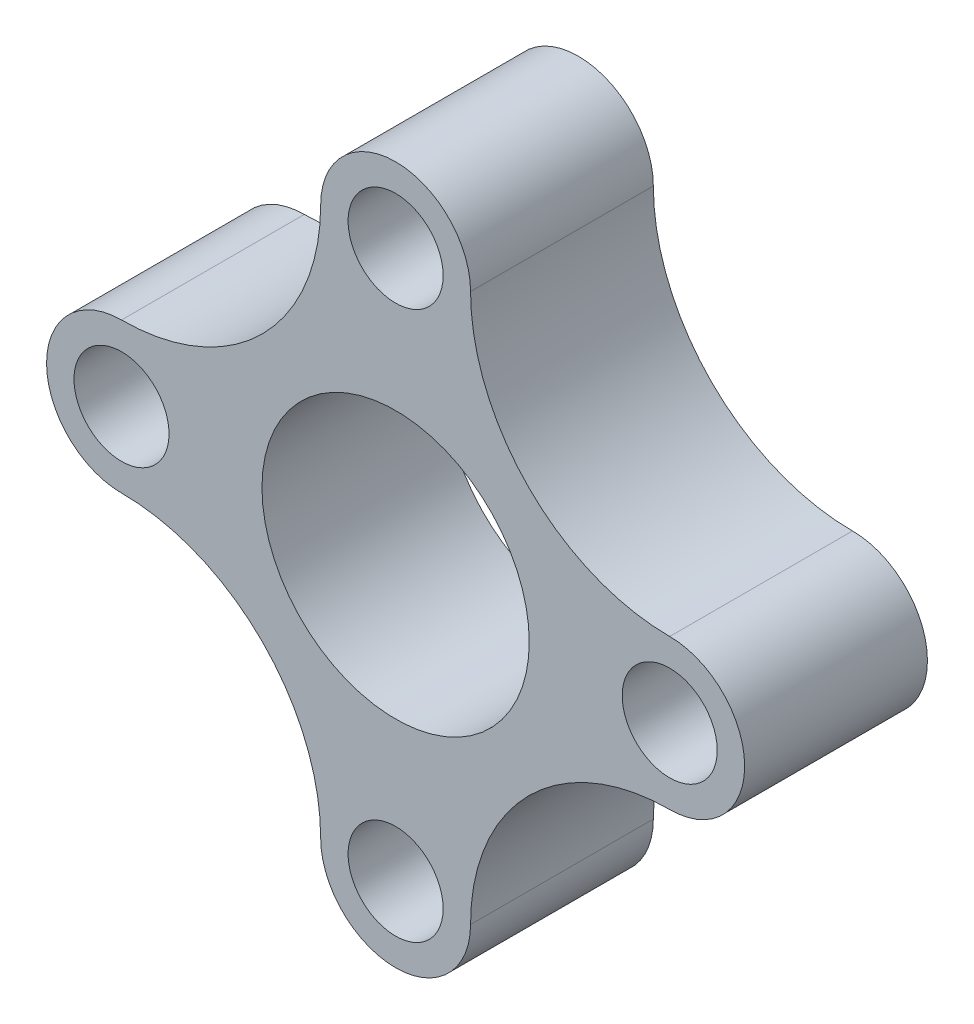
ISO-10303-21;
HEADER;
FILE_DESCRIPTION(('STEP AP214'),'2;1');
FILE_NAME('part.step','',(''),(''),'','','');
FILE_SCHEMA(('AUTOMOTIVE_DESIGN { 1 0 10303 214 1 1 1 1 }'));
ENDSEC;
DATA;
#1=APPLICATION_CONTEXT('core data for automotive mechanical design processes');
#2=APPLICATION_PROTOCOL_DEFINITION('international standard','automotive_design',2000,#1);
#3=PRODUCT_CONTEXT('',#1,'mechanical');
#4=PRODUCT('Part','Part','',(#3));
#5=PRODUCT_RELATED_PRODUCT_CATEGORY('part','',(#4));
#6=PRODUCT_DEFINITION_FORMATION('','',#4);
#7=PRODUCT_DEFINITION_CONTEXT('part definition',#1,'design');
#8=PRODUCT_DEFINITION('design','',#6,#7);
#9=PRODUCT_DEFINITION_SHAPE('','',#8);
#10=(LENGTH_UNIT() NAMED_UNIT(*) SI_UNIT(.MILLI.,.METRE.));
#11=(NAMED_UNIT(*) PLANE_ANGLE_UNIT() SI_UNIT($,.RADIAN.));
#12=(NAMED_UNIT(*) SI_UNIT($,.STERADIAN.) SOLID_ANGLE_UNIT());
#13=UNCERTAINTY_MEASURE_WITH_UNIT(LENGTH_MEASURE(1.E-05),#10,'distance_accuracy_value','');
#14=(GEOMETRIC_REPRESENTATION_CONTEXT(3) GLOBAL_UNCERTAINTY_ASSIGNED_CONTEXT((#13)) GLOBAL_UNIT_ASSIGNED_CONTEXT((#10,
#11,#12)) REPRESENTATION_CONTEXT('',''));
#15=CARTESIAN_POINT('',(0.,0.,0.));
#16=DIRECTION('',(0.,0.,1.));
#17=DIRECTION('',(1.,0.,0.));
#18=AXIS2_PLACEMENT_3D('',#15,#16,#17);
#19=CARTESIAN_POINT('',(14.9957751629703,0.,10.));
#20=DIRECTION('',(0.,0.,1.));
#21=DIRECTION('',(1.,0.,0.));
#22=AXIS2_PLACEMENT_3D('',#19,#20,#21);
#23=PLANE('',#22);
#24=CARTESIAN_POINT('',(-14.9957751629704,0.,10.));
#25=DIRECTION('',(0.,0.,1.));
#26=DIRECTION('',(1.,0.,0.));
#27=AXIS2_PLACEMENT_3D('',#24,#25,#26);
#28=CIRCLE('',#27,2.6);
#29=CARTESIAN_POINT('',(-12.3957751629704,0.,10.));
#30=VERTEX_POINT('',#29);
#31=EDGE_CURVE('E356',#30,#30,#28,.T.);
#32=ORIENTED_EDGE('',*,*,#31,.F.);
#33=EDGE_LOOP('',(#32));
#34=FACE_BOUND('',#33,.T.);
#35=CARTESIAN_POINT('',(14.9957751629703,0.,10.));
#36=DIRECTION('',(0.,0.,1.));
#37=DIRECTION('',(1.,0.,0.));
#38=AXIS2_PLACEMENT_3D('',#35,#36,#37);
#39=CIRCLE('',#38,2.6);
#40=CARTESIAN_POINT('',(17.5957751629703,0.,10.));
#41=VERTEX_POINT('',#40);
#42=EDGE_CURVE('E344',#41,#41,#39,.T.);
#43=ORIENTED_EDGE('',*,*,#42,.F.);
#44=EDGE_LOOP('',(#43));
#45=FACE_BOUND('',#44,.T.);
#46=CARTESIAN_POINT('',(0.,14.9957751629703,10.));
#47=DIRECTION('',(0.,0.,1.));
#48=DIRECTION('',(-1.,0.,0.));
#49=AXIS2_PLACEMENT_3D('',#46,#47,#48);
#50=CIRCLE('',#49,4.1);
#51=CARTESIAN_POINT('',(4.1,14.9957751629703,10.));
#52=VERTEX_POINT('',#51);
#53=CARTESIAN_POINT('',(-4.1,14.9957751629703,10.));
#54=VERTEX_POINT('',#53);
#55=EDGE_CURVE('E120',#52,#54,#50,.T.);
#56=ORIENTED_EDGE('',*,*,#55,.T.);
#57=CARTESIAN_POINT('',(-14.9957751629703,14.9957751629703,10.));
#58=DIRECTION('',(0.,0.,1.));
#59=DIRECTION('',(-1.,0.,0.));
#60=AXIS2_PLACEMENT_3D('',#57,#58,#59);
#61=CIRCLE('',#60,10.8957751629703);
#62=CARTESIAN_POINT('',(-14.9957751629703,4.1,10.));
#63=VERTEX_POINT('',#62);
#64=EDGE_CURVE('E148',#63,#54,#61,.T.);
#65=ORIENTED_EDGE('',*,*,#64,.F.);
#66=CARTESIAN_POINT('',(-14.9957751629703,0.,10.));
#67=DIRECTION('',(0.,0.,-1.));
#68=DIRECTION('',(-1.,0.,0.));
#69=AXIS2_PLACEMENT_3D('',#66,#67,#68);
#70=CIRCLE('',#69,4.1);
#71=CARTESIAN_POINT('',(-14.9957751629703,-4.1,10.));
#72=VERTEX_POINT('',#71);
#73=EDGE_CURVE('E145',#72,#63,#70,.T.);
#74=ORIENTED_EDGE('',*,*,#73,.F.);
#75=CARTESIAN_POINT('',(-14.9957751629703,-14.9957751629703,10.));
#76=DIRECTION('',(0.,0.,-1.));
#77=DIRECTION('',(-1.,0.,0.));
#78=AXIS2_PLACEMENT_3D('',#75,#76,#77);
#79=CIRCLE('',#78,10.8957751629703);
#80=CARTESIAN_POINT('',(-4.1,-14.9957751629703,10.));
#81=VERTEX_POINT('',#80);
#82=EDGE_CURVE('E161',#72,#81,#79,.T.);
#83=ORIENTED_EDGE('',*,*,#82,.T.);
#84=CARTESIAN_POINT('',(0.,-14.9957751629703,10.));
#85=DIRECTION('',(0.,0.,-1.));
#86=DIRECTION('',(-1.,0.,0.));
#87=AXIS2_PLACEMENT_3D('',#84,#85,#86);
#88=CIRCLE('',#87,4.1);
#89=CARTESIAN_POINT('',(4.1,-14.9957751629703,10.));
#90=VERTEX_POINT('',#89);
#91=EDGE_CURVE('E70',#90,#81,#88,.T.);
#92=ORIENTED_EDGE('',*,*,#91,.F.);
#93=CARTESIAN_POINT('',(14.9957751629703,-14.9957751629703,10.));
#94=DIRECTION('',(0.,0.,1.));
#95=DIRECTION('',(1.,0.,0.));
#96=AXIS2_PLACEMENT_3D('',#93,#94,#95);
#97=CIRCLE('',#96,10.8957751629703);
#98=CARTESIAN_POINT('',(14.9957751629703,-4.1,10.));
#99=VERTEX_POINT('',#98);
#100=EDGE_CURVE('E95',#99,#90,#97,.T.);
#101=ORIENTED_EDGE('',*,*,#100,.F.);
#102=CARTESIAN_POINT('',(14.9957751629703,0.,10.));
#103=DIRECTION('',(0.,0.,1.));
#104=DIRECTION('',(1.,0.,0.));
#105=AXIS2_PLACEMENT_3D('',#102,#103,#104);
#106=CIRCLE('',#105,4.1);
#107=CARTESIAN_POINT('',(14.9957751629703,4.1,10.));
#108=VERTEX_POINT('',#107);
#109=EDGE_CURVE('E116',#99,#108,#106,.T.);
#110=ORIENTED_EDGE('',*,*,#109,.T.);
#111=CARTESIAN_POINT('',(14.9957751629703,14.9957751629703,10.));
#112=DIRECTION('',(0.,0.,-1.));
#113=DIRECTION('',(1.,0.,0.));
#114=AXIS2_PLACEMENT_3D('',#111,#112,#113);
#115=CIRCLE('',#114,10.8957751629703);
#116=EDGE_CURVE('E51',#108,#52,#115,.T.);
#117=ORIENTED_EDGE('',*,*,#116,.T.);
#118=EDGE_LOOP('',(#56,#65,#74,#83,#92,#101,#110,#117));
#119=FACE_BOUND('',#118,.T.);
#120=CARTESIAN_POINT('',(0.,14.9957751629703,10.));
#121=DIRECTION('',(0.,0.,1.));
#122=DIRECTION('',(1.,0.,0.));
#123=AXIS2_PLACEMENT_3D('',#120,#121,#122);
#124=CIRCLE('',#123,2.6);
#125=CARTESIAN_POINT('',(2.6,14.9957751629703,10.));
#126=VERTEX_POINT('',#125);
#127=EDGE_CURVE('E169',#126,#126,#124,.T.);
#128=ORIENTED_EDGE('',*,*,#127,.F.);
#129=EDGE_LOOP('',(#128));
#130=FACE_BOUND('',#129,.T.);
#131=CARTESIAN_POINT('',(0.,-14.9957751629704,10.));
#132=DIRECTION('',(0.,0.,1.));
#133=DIRECTION('',(1.,0.,0.));
#134=AXIS2_PLACEMENT_3D('',#131,#132,#133);
#135=CIRCLE('',#134,2.6);
#136=CARTESIAN_POINT('',(2.6,-14.9957751629704,10.));
#137=VERTEX_POINT('',#136);
#138=EDGE_CURVE('E350',#137,#137,#135,.T.);
#139=ORIENTED_EDGE('',*,*,#138,.F.);
#140=EDGE_LOOP('',(#139));
#141=FACE_BOUND('',#140,.T.);
#142=CARTESIAN_POINT('',(0.,0.,10.));
#143=DIRECTION('',(0.,0.,1.));
#144=DIRECTION('',(1.,0.,0.));
#145=AXIS2_PLACEMENT_3D('',#142,#143,#144);
#146=CIRCLE('',#145,7.31145345079993);
#147=CARTESIAN_POINT('',(7.31145345079993,0.,10.));
#148=VERTEX_POINT('',#147);
#149=EDGE_CURVE('E362',#148,#148,#146,.T.);
#150=ORIENTED_EDGE('',*,*,#149,.F.);
#151=EDGE_LOOP('',(#150));
#152=FACE_BOUND('',#151,.T.);
#153=ADVANCED_FACE('F34',(#34,#45,#119,#130,#141,#152),#23,.T.);
#154=CARTESIAN_POINT('',(14.9957751629703,0.,0.));
#155=DIRECTION('',(0.,0.,1.));
#156=DIRECTION('',(1.,0.,0.));
#157=AXIS2_PLACEMENT_3D('',#154,#155,#156);
#158=PLANE('',#157);
#159=CARTESIAN_POINT('',(-14.9957751629704,0.,0.));
#160=DIRECTION('',(0.,0.,1.));
#161=DIRECTION('',(1.,0.,0.));
#162=AXIS2_PLACEMENT_3D('',#159,#160,#161);
#163=CIRCLE('',#162,2.6);
#164=CARTESIAN_POINT('',(-12.3957751629704,0.,0.));
#165=VERTEX_POINT('',#164);
#166=EDGE_CURVE('E359',#165,#165,#163,.T.);
#167=ORIENTED_EDGE('',*,*,#166,.T.);
#168=EDGE_LOOP('',(#167));
#169=FACE_BOUND('',#168,.T.);
#170=CARTESIAN_POINT('',(14.9957751629703,0.,0.));
#171=DIRECTION('',(0.,0.,1.));
#172=DIRECTION('',(1.,0.,0.));
#173=AXIS2_PLACEMENT_3D('',#170,#171,#172);
#174=CIRCLE('',#173,2.6);
#175=CARTESIAN_POINT('',(17.5957751629703,0.,0.));
#176=VERTEX_POINT('',#175);
#177=EDGE_CURVE('E346',#176,#176,#174,.T.);
#178=ORIENTED_EDGE('',*,*,#177,.T.);
#179=EDGE_LOOP('',(#178));
#180=FACE_BOUND('',#179,.T.);
#181=CARTESIAN_POINT('',(14.9957751629703,0.,0.));
#182=DIRECTION('',(0.,0.,1.));
#183=DIRECTION('',(1.,0.,0.));
#184=AXIS2_PLACEMENT_3D('',#181,#182,#183);
#185=CIRCLE('',#184,4.1);
#186=CARTESIAN_POINT('',(14.9957751629703,-4.1,0.));
#187=VERTEX_POINT('',#186);
#188=CARTESIAN_POINT('',(14.9957751629703,4.1,0.));
#189=VERTEX_POINT('',#188);
#190=EDGE_CURVE('E62',#187,#189,#185,.T.);
#191=ORIENTED_EDGE('',*,*,#190,.F.);
#192=CARTESIAN_POINT('',(14.9957751629703,-14.9957751629703,0.));
#193=DIRECTION('',(0.,0.,1.));
#194=DIRECTION('',(1.,0.,0.));
#195=AXIS2_PLACEMENT_3D('',#192,#193,#194);
#196=CIRCLE('',#195,10.8957751629703);
#197=CARTESIAN_POINT('',(4.1,-14.9957751629703,0.));
#198=VERTEX_POINT('',#197);
#199=EDGE_CURVE('E96',#187,#198,#196,.T.);
#200=ORIENTED_EDGE('',*,*,#199,.T.);
#201=CARTESIAN_POINT('',(0.,-14.9957751629703,0.));
#202=DIRECTION('',(0.,0.,-1.));
#203=DIRECTION('',(-1.,0.,0.));
#204=AXIS2_PLACEMENT_3D('',#201,#202,#203);
#205=CIRCLE('',#204,4.1);
#206=CARTESIAN_POINT('',(-4.1,-14.9957751629703,0.));
#207=VERTEX_POINT('',#206);
#208=EDGE_CURVE('E83',#198,#207,#205,.T.);
#209=ORIENTED_EDGE('',*,*,#208,.T.);
#210=CARTESIAN_POINT('',(-14.9957751629703,-14.9957751629703,0.));
#211=DIRECTION('',(0.,0.,-1.));
#212=DIRECTION('',(-1.,0.,0.));
#213=AXIS2_PLACEMENT_3D('',#210,#211,#212);
#214=CIRCLE('',#213,10.8957751629703);
#215=CARTESIAN_POINT('',(-14.9957751629703,-4.1,0.));
#216=VERTEX_POINT('',#215);
#217=EDGE_CURVE('E163',#216,#207,#214,.T.);
#218=ORIENTED_EDGE('',*,*,#217,.F.);
#219=CARTESIAN_POINT('',(-14.9957751629703,0.,0.));
#220=DIRECTION('',(0.,0.,-1.));
#221=DIRECTION('',(-1.,0.,0.));
#222=AXIS2_PLACEMENT_3D('',#219,#220,#221);
#223=CIRCLE('',#222,4.1);
#224=CARTESIAN_POINT('',(-14.9957751629703,4.1,0.));
#225=VERTEX_POINT('',#224);
#226=EDGE_CURVE('E141',#216,#225,#223,.T.);
#227=ORIENTED_EDGE('',*,*,#226,.T.);
#228=CARTESIAN_POINT('',(-14.9957751629703,14.9957751629703,0.));
#229=DIRECTION('',(0.,0.,1.));
#230=DIRECTION('',(-1.,0.,0.));
#231=AXIS2_PLACEMENT_3D('',#228,#229,#230);
#232=CIRCLE('',#231,10.8957751629703);
#233=CARTESIAN_POINT('',(-4.1,14.9957751629703,0.));
#234=VERTEX_POINT('',#233);
#235=EDGE_CURVE('E138',#225,#234,#232,.T.);
#236=ORIENTED_EDGE('',*,*,#235,.T.);
#237=CARTESIAN_POINT('',(0.,14.9957751629703,0.));
#238=DIRECTION('',(0.,0.,1.));
#239=DIRECTION('',(-1.,0.,0.));
#240=AXIS2_PLACEMENT_3D('',#237,#238,#239);
#241=CIRCLE('',#240,4.1);
#242=CARTESIAN_POINT('',(4.1,14.9957751629703,0.));
#243=VERTEX_POINT('',#242);
#244=EDGE_CURVE('E118',#243,#234,#241,.T.);
#245=ORIENTED_EDGE('',*,*,#244,.F.);
#246=CARTESIAN_POINT('',(14.9957751629703,14.9957751629703,0.));
#247=DIRECTION('',(0.,0.,-1.));
#248=DIRECTION('',(1.,0.,0.));
#249=AXIS2_PLACEMENT_3D('',#246,#247,#248);
#250=CIRCLE('',#249,10.8957751629703);
#251=EDGE_CURVE('E123',#189,#243,#250,.T.);
#252=ORIENTED_EDGE('',*,*,#251,.F.);
#253=EDGE_LOOP('',(#191,#200,#209,#218,#227,#236,#245,#252));
#254=FACE_BOUND('',#253,.T.);
#255=CARTESIAN_POINT('',(0.,14.9957751629703,0.));
#256=DIRECTION('',(0.,0.,1.));
#257=DIRECTION('',(1.,0.,0.));
#258=AXIS2_PLACEMENT_3D('',#255,#256,#257);
#259=CIRCLE('',#258,2.6);
#260=CARTESIAN_POINT('',(2.6,14.9957751629703,0.));
#261=VERTEX_POINT('',#260);
#262=EDGE_CURVE('E172',#261,#261,#259,.T.);
#263=ORIENTED_EDGE('',*,*,#262,.T.);
#264=EDGE_LOOP('',(#263));
#265=FACE_BOUND('',#264,.T.);
#266=CARTESIAN_POINT('',(0.,-14.9957751629704,0.));
#267=DIRECTION('',(0.,0.,1.));
#268=DIRECTION('',(1.,0.,0.));
#269=AXIS2_PLACEMENT_3D('',#266,#267,#268);
#270=CIRCLE('',#269,2.6);
#271=CARTESIAN_POINT('',(2.6,-14.9957751629704,0.));
#272=VERTEX_POINT('',#271);
#273=EDGE_CURVE('E353',#272,#272,#270,.T.);
#274=ORIENTED_EDGE('',*,*,#273,.T.);
#275=EDGE_LOOP('',(#274));
#276=FACE_BOUND('',#275,.T.);
#277=CARTESIAN_POINT('',(0.,0.,0.));
#278=DIRECTION('',(0.,0.,1.));
#279=DIRECTION('',(1.,0.,0.));
#280=AXIS2_PLACEMENT_3D('',#277,#278,#279);
#281=CIRCLE('',#280,7.31145345079993);
#282=CARTESIAN_POINT('',(7.31145345079993,0.,0.));
#283=VERTEX_POINT('',#282);
#284=EDGE_CURVE('E365',#283,#283,#281,.T.);
#285=ORIENTED_EDGE('',*,*,#284,.T.);
#286=EDGE_LOOP('',(#285));
#287=FACE_BOUND('',#286,.T.);
#288=ADVANCED_FACE('F104',(#169,#180,#254,#265,#276,#287),#158,.F.);
#289=CARTESIAN_POINT('',(14.9957751629703,0.,10.));
#290=DIRECTION('',(0.,0.,-1.));
#291=DIRECTION('',(-1.,0.,0.));
#292=AXIS2_PLACEMENT_3D('',#289,#290,#291);
#293=CYLINDRICAL_SURFACE('',#292,4.1);
#294=ORIENTED_EDGE('',*,*,#190,.T.);
#295=DIRECTION('',(0.,0.,-1.));
#296=VECTOR('',#295,1.);
#297=CARTESIAN_POINT('',(14.9957751629703,4.1,10.));
#298=LINE('',#297,#296);
#299=EDGE_CURVE('E11',#108,#189,#298,.T.);
#300=ORIENTED_EDGE('',*,*,#299,.F.);
#301=ORIENTED_EDGE('',*,*,#109,.F.);
#302=DIRECTION('',(0.,0.,-1.));
#303=VECTOR('',#302,1.);
#304=CARTESIAN_POINT('',(14.9957751629703,-4.1,10.));
#305=LINE('',#304,#303);
#306=EDGE_CURVE('E102',#99,#187,#305,.T.);
#307=ORIENTED_EDGE('',*,*,#306,.T.);
#308=EDGE_LOOP('',(#294,#300,#301,#307));
#309=FACE_BOUND('',#308,.T.);
#310=ADVANCED_FACE('F36',(#309),#293,.T.);
#311=CARTESIAN_POINT('',(14.9957751629703,14.9957751629703,10.));
#312=DIRECTION('',(0.,0.,-1.));
#313=DIRECTION('',(-1.,0.,0.));
#314=AXIS2_PLACEMENT_3D('',#311,#312,#313);
#315=CYLINDRICAL_SURFACE('',#314,10.8957751629703);
#316=ORIENTED_EDGE('',*,*,#251,.T.);
#317=DIRECTION('',(0.,0.,-1.));
#318=VECTOR('',#317,1.);
#319=CARTESIAN_POINT('',(4.1,14.9957751629703,10.));
#320=LINE('',#319,#318);
#321=EDGE_CURVE('E43',#52,#243,#320,.T.);
#322=ORIENTED_EDGE('',*,*,#321,.F.);
#323=ORIENTED_EDGE('',*,*,#116,.F.);
#324=ORIENTED_EDGE('',*,*,#299,.T.);
#325=EDGE_LOOP('',(#316,#322,#323,#324));
#326=FACE_BOUND('',#325,.T.);
#327=ADVANCED_FACE('F207',(#326),#315,.F.);
#328=CARTESIAN_POINT('',(0.,14.9957751629703,10.));
#329=DIRECTION('',(0.,0.,-1.));
#330=DIRECTION('',(-1.,0.,0.));
#331=AXIS2_PLACEMENT_3D('',#328,#329,#330);
#332=CYLINDRICAL_SURFACE('',#331,4.1);
#333=ORIENTED_EDGE('',*,*,#244,.T.);
#334=DIRECTION('',(0.,0.,-1.));
#335=VECTOR('',#334,1.);
#336=CARTESIAN_POINT('',(-4.1,14.9957751629703,10.));
#337=LINE('',#336,#335);
#338=EDGE_CURVE('E110',#54,#234,#337,.T.);
#339=ORIENTED_EDGE('',*,*,#338,.F.);
#340=ORIENTED_EDGE('',*,*,#55,.F.);
#341=ORIENTED_EDGE('',*,*,#321,.T.);
#342=EDGE_LOOP('',(#333,#339,#340,#341));
#343=FACE_BOUND('',#342,.T.);
#344=ADVANCED_FACE('F130',(#343),#332,.T.);
#345=CARTESIAN_POINT('',(14.9957751629703,-14.9957751629703,10.));
#346=DIRECTION('',(0.,0.,-1.));
#347=DIRECTION('',(-1.,0.,0.));
#348=AXIS2_PLACEMENT_3D('',#345,#346,#347);
#349=CYLINDRICAL_SURFACE('',#348,10.8957751629703);
#350=ORIENTED_EDGE('',*,*,#199,.F.);
#351=ORIENTED_EDGE('',*,*,#306,.F.);
#352=ORIENTED_EDGE('',*,*,#100,.T.);
#353=DIRECTION('',(0.,0.,-1.));
#354=VECTOR('',#353,1.);
#355=CARTESIAN_POINT('',(4.1,-14.9957751629703,10.));
#356=LINE('',#355,#354);
#357=EDGE_CURVE('E86',#90,#198,#356,.T.);
#358=ORIENTED_EDGE('',*,*,#357,.T.);
#359=EDGE_LOOP('',(#350,#351,#352,#358));
#360=FACE_BOUND('',#359,.T.);
#361=ADVANCED_FACE('F100',(#360),#349,.F.);
#362=CARTESIAN_POINT('',(0.,-14.9957751629703,10.));
#363=DIRECTION('',(0.,0.,-1.));
#364=DIRECTION('',(-1.,0.,0.));
#365=AXIS2_PLACEMENT_3D('',#362,#363,#364);
#366=CYLINDRICAL_SURFACE('',#365,4.1);
#367=ORIENTED_EDGE('',*,*,#208,.F.);
#368=ORIENTED_EDGE('',*,*,#357,.F.);
#369=ORIENTED_EDGE('',*,*,#91,.T.);
#370=DIRECTION('',(0.,0.,-1.));
#371=VECTOR('',#370,1.);
#372=CARTESIAN_POINT('',(-4.1,-14.9957751629703,10.));
#373=LINE('',#372,#371);
#374=EDGE_CURVE('E90',#81,#207,#373,.T.);
#375=ORIENTED_EDGE('',*,*,#374,.T.);
#376=EDGE_LOOP('',(#367,#368,#369,#375));
#377=FACE_BOUND('',#376,.T.);
#378=ADVANCED_FACE('F85',(#377),#366,.T.);
#379=CARTESIAN_POINT('',(-14.9957751629703,0.,10.));
#380=DIRECTION('',(0.,0.,-1.));
#381=DIRECTION('',(1.,0.,0.));
#382=AXIS2_PLACEMENT_3D('',#379,#380,#381);
#383=CYLINDRICAL_SURFACE('',#382,4.1);
#384=ORIENTED_EDGE('',*,*,#226,.F.);
#385=DIRECTION('',(0.,0.,-1.));
#386=VECTOR('',#385,1.);
#387=CARTESIAN_POINT('',(-14.9957751629703,-4.1,10.));
#388=LINE('',#387,#386);
#389=EDGE_CURVE('E150',#72,#216,#388,.T.);
#390=ORIENTED_EDGE('',*,*,#389,.F.);
#391=ORIENTED_EDGE('',*,*,#73,.T.);
#392=DIRECTION('',(0.,0.,-1.));
#393=VECTOR('',#392,1.);
#394=CARTESIAN_POINT('',(-14.9957751629703,4.1,10.));
#395=LINE('',#394,#393);
#396=EDGE_CURVE('E107',#63,#225,#395,.T.);
#397=ORIENTED_EDGE('',*,*,#396,.T.);
#398=EDGE_LOOP('',(#384,#390,#391,#397));
#399=FACE_BOUND('',#398,.T.);
#400=ADVANCED_FACE('F185',(#399),#383,.T.);
#401=CARTESIAN_POINT('',(-14.9957751629703,14.9957751629703,10.));
#402=DIRECTION('',(0.,0.,-1.));
#403=DIRECTION('',(1.,0.,0.));
#404=AXIS2_PLACEMENT_3D('',#401,#402,#403);
#405=CYLINDRICAL_SURFACE('',#404,10.8957751629703);
#406=ORIENTED_EDGE('',*,*,#235,.F.);
#407=ORIENTED_EDGE('',*,*,#396,.F.);
#408=ORIENTED_EDGE('',*,*,#64,.T.);
#409=ORIENTED_EDGE('',*,*,#338,.T.);
#410=EDGE_LOOP('',(#406,#407,#408,#409));
#411=FACE_BOUND('',#410,.T.);
#412=ADVANCED_FACE('F176',(#411),#405,.F.);
#413=CARTESIAN_POINT('',(-14.9957751629703,-14.9957751629703,10.));
#414=DIRECTION('',(0.,0.,-1.));
#415=DIRECTION('',(1.,0.,0.));
#416=AXIS2_PLACEMENT_3D('',#413,#414,#415);
#417=CYLINDRICAL_SURFACE('',#416,10.8957751629703);
#418=ORIENTED_EDGE('',*,*,#217,.T.);
#419=ORIENTED_EDGE('',*,*,#374,.F.);
#420=ORIENTED_EDGE('',*,*,#82,.F.);
#421=ORIENTED_EDGE('',*,*,#389,.T.);
#422=EDGE_LOOP('',(#418,#419,#420,#421));
#423=FACE_BOUND('',#422,.T.);
#424=ADVANCED_FACE('F159',(#423),#417,.F.);
#425=CARTESIAN_POINT('',(0.,14.9957751629703,10.));
#426=DIRECTION('',(0.,0.,-1.));
#427=DIRECTION('',(-1.,0.,0.));
#428=AXIS2_PLACEMENT_3D('',#425,#426,#427);
#429=CYLINDRICAL_SURFACE('',#428,2.6);
#430=ORIENTED_EDGE('',*,*,#127,.T.);
#431=EDGE_LOOP('',(#430));
#432=FACE_BOUND('',#431,.T.);
#433=ORIENTED_EDGE('',*,*,#262,.F.);
#434=EDGE_LOOP('',(#433));
#435=FACE_BOUND('',#434,.T.);
#436=ADVANCED_FACE('F259',(#432,#435),#429,.F.);
#437=CARTESIAN_POINT('',(14.9957751629703,0.,10.));
#438=DIRECTION('',(0.,0.,-1.));
#439=DIRECTION('',(-1.,0.,0.));
#440=AXIS2_PLACEMENT_3D('',#437,#438,#439);
#441=CYLINDRICAL_SURFACE('',#440,2.6);
#442=ORIENTED_EDGE('',*,*,#42,.T.);
#443=EDGE_LOOP('',(#442));
#444=FACE_BOUND('',#443,.T.);
#445=ORIENTED_EDGE('',*,*,#177,.F.);
#446=EDGE_LOOP('',(#445));
#447=FACE_BOUND('',#446,.T.);
#448=ADVANCED_FACE('F251',(#444,#447),#441,.F.);
#449=CARTESIAN_POINT('',(0.,-14.9957751629704,10.));
#450=DIRECTION('',(0.,0.,-1.));
#451=DIRECTION('',(-1.,0.,0.));
#452=AXIS2_PLACEMENT_3D('',#449,#450,#451);
#453=CYLINDRICAL_SURFACE('',#452,2.6);
#454=ORIENTED_EDGE('',*,*,#138,.T.);
#455=EDGE_LOOP('',(#454));
#456=FACE_BOUND('',#455,.T.);
#457=ORIENTED_EDGE('',*,*,#273,.F.);
#458=EDGE_LOOP('',(#457));
#459=FACE_BOUND('',#458,.T.);
#460=ADVANCED_FACE('F243',(#456,#459),#453,.F.);
#461=CARTESIAN_POINT('',(-14.9957751629704,0.,10.));
#462=DIRECTION('',(0.,0.,-1.));
#463=DIRECTION('',(-1.,0.,0.));
#464=AXIS2_PLACEMENT_3D('',#461,#462,#463);
#465=CYLINDRICAL_SURFACE('',#464,2.6);
#466=ORIENTED_EDGE('',*,*,#31,.T.);
#467=EDGE_LOOP('',(#466));
#468=FACE_BOUND('',#467,.T.);
#469=ORIENTED_EDGE('',*,*,#166,.F.);
#470=EDGE_LOOP('',(#469));
#471=FACE_BOUND('',#470,.T.);
#472=ADVANCED_FACE('F234',(#468,#471),#465,.F.);
#473=CARTESIAN_POINT('',(0.,0.,10.));
#474=DIRECTION('',(0.,0.,-1.));
#475=DIRECTION('',(-1.,0.,0.));
#476=AXIS2_PLACEMENT_3D('',#473,#474,#475);
#477=CYLINDRICAL_SURFACE('',#476,7.31145345079993);
#478=ORIENTED_EDGE('',*,*,#149,.T.);
#479=EDGE_LOOP('',(#478));
#480=FACE_BOUND('',#479,.T.);
#481=ORIENTED_EDGE('',*,*,#284,.F.);
#482=EDGE_LOOP('',(#481));
#483=FACE_BOUND('',#482,.T.);
#484=ADVANCED_FACE('F230',(#480,#483),#477,.F.);
#485=CLOSED_SHELL('',(#153,#288,#310,#327,#344,#361,#378,#400,#412,#424,#436,#448,#460,#472,#484));
#486=MANIFOLD_SOLID_BREP('B2',#485);
#487=ADVANCED_BREP_SHAPE_REPRESENTATION('',(#18,#486),#14);
#488=SHAPE_DEFINITION_REPRESENTATION(#9,#487);
ENDSEC;
END-ISO-10303-21;
